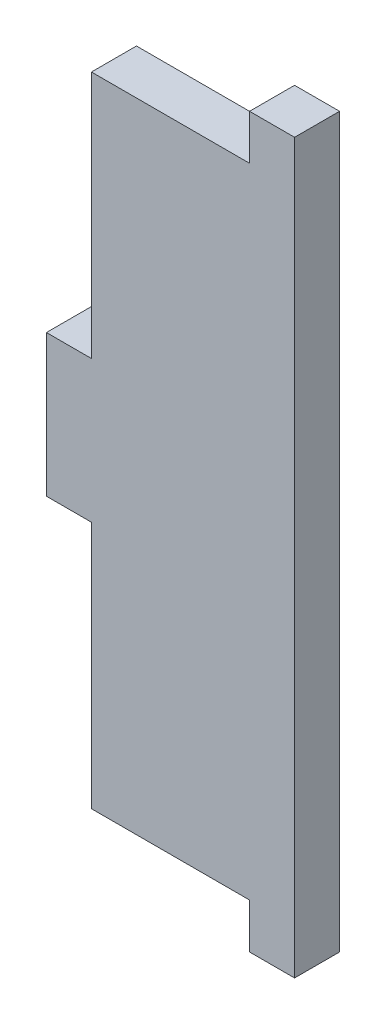
ISO-10303-21;
HEADER;
FILE_DESCRIPTION(('STEP AP214'),'2;1');
FILE_NAME('part.step','',(''),(''),'','','');
FILE_SCHEMA(('AUTOMOTIVE_DESIGN { 1 0 10303 214 1 1 1 1 }'));
ENDSEC;
DATA;
#1=APPLICATION_CONTEXT('core data for automotive mechanical design processes');
#2=APPLICATION_PROTOCOL_DEFINITION('international standard','automotive_design',2000,#1);
#3=PRODUCT_CONTEXT('',#1,'mechanical');
#4=PRODUCT('Part','Part','',(#3));
#5=PRODUCT_RELATED_PRODUCT_CATEGORY('part','',(#4));
#6=PRODUCT_DEFINITION_FORMATION('','',#4);
#7=PRODUCT_DEFINITION_CONTEXT('part definition',#1,'design');
#8=PRODUCT_DEFINITION('design','',#6,#7);
#9=PRODUCT_DEFINITION_SHAPE('','',#8);
#10=(LENGTH_UNIT() NAMED_UNIT(*) SI_UNIT(.MILLI.,.METRE.));
#11=(NAMED_UNIT(*) PLANE_ANGLE_UNIT() SI_UNIT($,.RADIAN.));
#12=(NAMED_UNIT(*) SI_UNIT($,.STERADIAN.) SOLID_ANGLE_UNIT());
#13=UNCERTAINTY_MEASURE_WITH_UNIT(LENGTH_MEASURE(1.E-05),#10,'distance_accuracy_value','');
#14=(GEOMETRIC_REPRESENTATION_CONTEXT(3) GLOBAL_UNCERTAINTY_ASSIGNED_CONTEXT((#13)) GLOBAL_UNIT_ASSIGNED_CONTEXT((#10,
#11,#12)) REPRESENTATION_CONTEXT('',''));
#15=CARTESIAN_POINT('',(0.,0.,0.));
#16=DIRECTION('',(0.,0.,1.));
#17=DIRECTION('',(1.,0.,0.));
#18=AXIS2_PLACEMENT_3D('',#15,#16,#17);
#19=CARTESIAN_POINT('',(0.,0.,6.35));
#20=DIRECTION('',(0.,-1.,0.));
#21=DIRECTION('',(0.,0.,-1.));
#22=AXIS2_PLACEMENT_3D('',#19,#20,#21);
#23=PLANE('',#22);
#24=DIRECTION('',(-1.,0.,0.));
#25=VECTOR('',#24,1.);
#26=CARTESIAN_POINT('',(0.,0.,0.));
#27=LINE('',#26,#25);
#28=CARTESIAN_POINT('',(22.3,0.,0.));
#29=VERTEX_POINT('',#28);
#30=CARTESIAN_POINT('',(0.,0.,0.));
#31=VERTEX_POINT('',#30);
#32=EDGE_CURVE('E152',#29,#31,#27,.T.);
#33=ORIENTED_EDGE('',*,*,#32,.T.);
#34=DIRECTION('',(0.,0.,-1.));
#35=VECTOR('',#34,1.);
#36=CARTESIAN_POINT('',(0.,0.,6.35));
#37=LINE('',#36,#35);
#38=CARTESIAN_POINT('',(0.,0.,6.35));
#39=VERTEX_POINT('',#38);
#40=EDGE_CURVE('E11',#39,#31,#37,.T.);
#41=ORIENTED_EDGE('',*,*,#40,.F.);
#42=DIRECTION('',(-1.,0.,0.));
#43=VECTOR('',#42,1.);
#44=CARTESIAN_POINT('',(0.,0.,6.35));
#45=LINE('',#44,#43);
#46=CARTESIAN_POINT('',(22.3,0.,6.35));
#47=VERTEX_POINT('',#46);
#48=EDGE_CURVE('E175',#47,#39,#45,.T.);
#49=ORIENTED_EDGE('',*,*,#48,.F.);
#50=DIRECTION('',(0.,0.,-1.));
#51=VECTOR('',#50,1.);
#52=CARTESIAN_POINT('',(22.3,0.,6.35));
#53=LINE('',#52,#51);
#54=EDGE_CURVE('E148',#47,#29,#53,.T.);
#55=ORIENTED_EDGE('',*,*,#54,.T.);
#56=EDGE_LOOP('',(#33,#41,#49,#55));
#57=FACE_BOUND('',#56,.T.);
#58=ADVANCED_FACE('F33',(#57),#23,.F.);
#59=CARTESIAN_POINT('',(0.,0.,6.35));
#60=DIRECTION('',(1.,0.,0.));
#61=DIRECTION('',(0.,1.,0.));
#62=AXIS2_PLACEMENT_3D('',#59,#60,#61);
#63=PLANE('',#62);
#64=DIRECTION('',(0.,-1.,0.));
#65=VECTOR('',#64,1.);
#66=CARTESIAN_POINT('',(0.,0.,0.));
#67=LINE('',#66,#65);
#68=CARTESIAN_POINT('',(0.,-35.,0.));
#69=VERTEX_POINT('',#68);
#70=EDGE_CURVE('E155',#31,#69,#67,.T.);
#71=ORIENTED_EDGE('',*,*,#70,.T.);
#72=DIRECTION('',(0.,0.,-1.));
#73=VECTOR('',#72,1.);
#74=CARTESIAN_POINT('',(0.,-35.,6.35));
#75=LINE('',#74,#73);
#76=CARTESIAN_POINT('',(0.,-35.,6.35));
#77=VERTEX_POINT('',#76);
#78=EDGE_CURVE('E41',#77,#69,#75,.T.);
#79=ORIENTED_EDGE('',*,*,#78,.F.);
#80=DIRECTION('',(0.,-1.,0.));
#81=VECTOR('',#80,1.);
#82=CARTESIAN_POINT('',(0.,0.,6.35));
#83=LINE('',#82,#81);
#84=EDGE_CURVE('E104',#39,#77,#83,.T.);
#85=ORIENTED_EDGE('',*,*,#84,.F.);
#86=ORIENTED_EDGE('',*,*,#40,.T.);
#87=EDGE_LOOP('',(#71,#79,#85,#86));
#88=FACE_BOUND('',#87,.T.);
#89=ADVANCED_FACE('F254',(#88),#63,.F.);
#90=CARTESIAN_POINT('',(0.,-35.,6.35));
#91=DIRECTION('',(0.,-1.,0.));
#92=DIRECTION('',(0.,0.,-1.));
#93=AXIS2_PLACEMENT_3D('',#90,#91,#92);
#94=PLANE('',#93);
#95=DIRECTION('',(-1.,0.,0.));
#96=VECTOR('',#95,1.);
#97=CARTESIAN_POINT('',(0.,-35.,0.));
#98=LINE('',#97,#96);
#99=CARTESIAN_POINT('',(-6.35,-35.,0.));
#100=VERTEX_POINT('',#99);
#101=EDGE_CURVE('E157',#69,#100,#98,.T.);
#102=ORIENTED_EDGE('',*,*,#101,.T.);
#103=DIRECTION('',(0.,0.,-1.));
#104=VECTOR('',#103,1.);
#105=CARTESIAN_POINT('',(-6.35,-35.,6.35));
#106=LINE('',#105,#104);
#107=CARTESIAN_POINT('',(-6.35,-35.,6.35));
#108=VERTEX_POINT('',#107);
#109=EDGE_CURVE('E194',#108,#100,#106,.T.);
#110=ORIENTED_EDGE('',*,*,#109,.F.);
#111=DIRECTION('',(-1.,0.,0.));
#112=VECTOR('',#111,1.);
#113=CARTESIAN_POINT('',(0.,-35.,6.35));
#114=LINE('',#113,#112);
#115=EDGE_CURVE('E202',#77,#108,#114,.T.);
#116=ORIENTED_EDGE('',*,*,#115,.F.);
#117=ORIENTED_EDGE('',*,*,#78,.T.);
#118=EDGE_LOOP('',(#102,#110,#116,#117));
#119=FACE_BOUND('',#118,.T.);
#120=ADVANCED_FACE('F200',(#119),#94,.F.);
#121=CARTESIAN_POINT('',(-6.35,-35.,6.35));
#122=DIRECTION('',(1.,0.,0.));
#123=DIRECTION('',(0.,1.,0.));
#124=AXIS2_PLACEMENT_3D('',#121,#122,#123);
#125=PLANE('',#124);
#126=DIRECTION('',(0.,-1.,0.));
#127=VECTOR('',#126,1.);
#128=CARTESIAN_POINT('',(-6.35,-35.,0.));
#129=LINE('',#128,#127);
#130=CARTESIAN_POINT('',(-6.34999999999999,-55.,0.));
#131=VERTEX_POINT('',#130);
#132=EDGE_CURVE('E159',#100,#131,#129,.T.);
#133=ORIENTED_EDGE('',*,*,#132,.T.);
#134=DIRECTION('',(0.,0.,-1.));
#135=VECTOR('',#134,1.);
#136=CARTESIAN_POINT('',(-6.34999999999999,-55.,6.35));
#137=LINE('',#136,#135);
#138=CARTESIAN_POINT('',(-6.34999999999999,-55.,6.35));
#139=VERTEX_POINT('',#138);
#140=EDGE_CURVE('E191',#139,#131,#137,.T.);
#141=ORIENTED_EDGE('',*,*,#140,.F.);
#142=DIRECTION('',(0.,-1.,0.));
#143=VECTOR('',#142,1.);
#144=CARTESIAN_POINT('',(-6.35,-35.,6.35));
#145=LINE('',#144,#143);
#146=EDGE_CURVE('E220',#108,#139,#145,.T.);
#147=ORIENTED_EDGE('',*,*,#146,.F.);
#148=ORIENTED_EDGE('',*,*,#109,.T.);
#149=EDGE_LOOP('',(#133,#141,#147,#148));
#150=FACE_BOUND('',#149,.T.);
#151=ADVANCED_FACE('F211',(#150),#125,.F.);
#152=CARTESIAN_POINT('',(-6.34999999999999,-55.,6.35));
#153=DIRECTION('',(0.,1.,0.));
#154=DIRECTION('',(0.,0.,1.));
#155=AXIS2_PLACEMENT_3D('',#152,#153,#154);
#156=PLANE('',#155);
#157=DIRECTION('',(1.,0.,0.));
#158=VECTOR('',#157,1.);
#159=CARTESIAN_POINT('',(-6.34999999999999,-55.,0.));
#160=LINE('',#159,#158);
#161=CARTESIAN_POINT('',(0.,-55.,0.));
#162=VERTEX_POINT('',#161);
#163=EDGE_CURVE('E161',#131,#162,#160,.T.);
#164=ORIENTED_EDGE('',*,*,#163,.T.);
#165=DIRECTION('',(0.,0.,-1.));
#166=VECTOR('',#165,1.);
#167=CARTESIAN_POINT('',(0.,-55.,6.35));
#168=LINE('',#167,#166);
#169=CARTESIAN_POINT('',(0.,-55.,6.35));
#170=VERTEX_POINT('',#169);
#171=EDGE_CURVE('E188',#170,#162,#168,.T.);
#172=ORIENTED_EDGE('',*,*,#171,.F.);
#173=DIRECTION('',(1.,0.,0.));
#174=VECTOR('',#173,1.);
#175=CARTESIAN_POINT('',(-6.34999999999999,-55.,6.35));
#176=LINE('',#175,#174);
#177=EDGE_CURVE('E217',#139,#170,#176,.T.);
#178=ORIENTED_EDGE('',*,*,#177,.F.);
#179=ORIENTED_EDGE('',*,*,#140,.T.);
#180=EDGE_LOOP('',(#164,#172,#178,#179));
#181=FACE_BOUND('',#180,.T.);
#182=ADVANCED_FACE('F215',(#181),#156,.F.);
#183=CARTESIAN_POINT('',(0.,-55.,6.35));
#184=DIRECTION('',(1.,0.,0.));
#185=DIRECTION('',(0.,1.,0.));
#186=AXIS2_PLACEMENT_3D('',#183,#184,#185);
#187=PLANE('',#186);
#188=DIRECTION('',(0.,-1.,0.));
#189=VECTOR('',#188,1.);
#190=CARTESIAN_POINT('',(0.,-55.,0.));
#191=LINE('',#190,#189);
#192=CARTESIAN_POINT('',(0.,-90.,0.));
#193=VERTEX_POINT('',#192);
#194=EDGE_CURVE('E163',#162,#193,#191,.T.);
#195=ORIENTED_EDGE('',*,*,#194,.T.);
#196=DIRECTION('',(0.,0.,-1.));
#197=VECTOR('',#196,1.);
#198=CARTESIAN_POINT('',(0.,-90.,6.35));
#199=LINE('',#198,#197);
#200=CARTESIAN_POINT('',(0.,-90.,6.35));
#201=VERTEX_POINT('',#200);
#202=EDGE_CURVE('E185',#201,#193,#199,.T.);
#203=ORIENTED_EDGE('',*,*,#202,.F.);
#204=DIRECTION('',(0.,-1.,0.));
#205=VECTOR('',#204,1.);
#206=CARTESIAN_POINT('',(0.,-55.,6.35));
#207=LINE('',#206,#205);
#208=EDGE_CURVE('E219',#170,#201,#207,.T.);
#209=ORIENTED_EDGE('',*,*,#208,.F.);
#210=ORIENTED_EDGE('',*,*,#171,.T.);
#211=EDGE_LOOP('',(#195,#203,#209,#210));
#212=FACE_BOUND('',#211,.T.);
#213=ADVANCED_FACE('F267',(#212),#187,.F.);
#214=CARTESIAN_POINT('',(0.,-90.,6.35));
#215=DIRECTION('',(0.,1.,0.));
#216=DIRECTION('',(0.,0.,1.));
#217=AXIS2_PLACEMENT_3D('',#214,#215,#216);
#218=PLANE('',#217);
#219=DIRECTION('',(1.,0.,0.));
#220=VECTOR('',#219,1.);
#221=CARTESIAN_POINT('',(0.,-90.,0.));
#222=LINE('',#221,#220);
#223=CARTESIAN_POINT('',(22.3,-90.,0.));
#224=VERTEX_POINT('',#223);
#225=EDGE_CURVE('E165',#193,#224,#222,.T.);
#226=ORIENTED_EDGE('',*,*,#225,.T.);
#227=DIRECTION('',(0.,0.,-1.));
#228=VECTOR('',#227,1.);
#229=CARTESIAN_POINT('',(22.3,-90.,6.35));
#230=LINE('',#229,#228);
#231=CARTESIAN_POINT('',(22.3,-90.,6.35));
#232=VERTEX_POINT('',#231);
#233=EDGE_CURVE('E182',#232,#224,#230,.T.);
#234=ORIENTED_EDGE('',*,*,#233,.F.);
#235=DIRECTION('',(1.,0.,0.));
#236=VECTOR('',#235,1.);
#237=CARTESIAN_POINT('',(0.,-90.,6.35));
#238=LINE('',#237,#236);
#239=EDGE_CURVE('E222',#201,#232,#238,.T.);
#240=ORIENTED_EDGE('',*,*,#239,.F.);
#241=ORIENTED_EDGE('',*,*,#202,.T.);
#242=EDGE_LOOP('',(#226,#234,#240,#241));
#243=FACE_BOUND('',#242,.T.);
#244=ADVANCED_FACE('F270',(#243),#218,.F.);
#245=CARTESIAN_POINT('',(22.3,-96.35,6.35));
#246=DIRECTION('',(1.,0.,0.));
#247=DIRECTION('',(0.,1.,0.));
#248=AXIS2_PLACEMENT_3D('',#245,#246,#247);
#249=PLANE('',#248);
#250=DIRECTION('',(0.,-1.,0.));
#251=VECTOR('',#250,1.);
#252=CARTESIAN_POINT('',(22.3,-96.35,0.));
#253=LINE('',#252,#251);
#254=CARTESIAN_POINT('',(22.3,-96.35,0.));
#255=VERTEX_POINT('',#254);
#256=EDGE_CURVE('E167',#224,#255,#253,.T.);
#257=ORIENTED_EDGE('',*,*,#256,.T.);
#258=DIRECTION('',(0.,0.,-1.));
#259=VECTOR('',#258,1.);
#260=CARTESIAN_POINT('',(22.3,-96.35,6.35));
#261=LINE('',#260,#259);
#262=CARTESIAN_POINT('',(22.3,-96.35,6.35));
#263=VERTEX_POINT('',#262);
#264=EDGE_CURVE('E179',#263,#255,#261,.T.);
#265=ORIENTED_EDGE('',*,*,#264,.F.);
#266=DIRECTION('',(0.,-1.,0.));
#267=VECTOR('',#266,1.);
#268=CARTESIAN_POINT('',(22.3,-96.35,6.35));
#269=LINE('',#268,#267);
#270=EDGE_CURVE('E228',#232,#263,#269,.T.);
#271=ORIENTED_EDGE('',*,*,#270,.F.);
#272=ORIENTED_EDGE('',*,*,#233,.T.);
#273=EDGE_LOOP('',(#257,#265,#271,#272));
#274=FACE_BOUND('',#273,.T.);
#275=ADVANCED_FACE('F234',(#274),#249,.F.);
#276=CARTESIAN_POINT('',(28.65,-96.35,6.35));
#277=DIRECTION('',(0.,1.,0.));
#278=DIRECTION('',(-1.,0.,0.));
#279=AXIS2_PLACEMENT_3D('',#276,#277,#278);
#280=PLANE('',#279);
#281=DIRECTION('',(1.,0.,0.));
#282=VECTOR('',#281,1.);
#283=CARTESIAN_POINT('',(28.65,-96.35,0.));
#284=LINE('',#283,#282);
#285=CARTESIAN_POINT('',(28.65,-96.35,0.));
#286=VERTEX_POINT('',#285);
#287=EDGE_CURVE('E169',#255,#286,#284,.T.);
#288=ORIENTED_EDGE('',*,*,#287,.T.);
#289=DIRECTION('',(0.,0.,-1.));
#290=VECTOR('',#289,1.);
#291=CARTESIAN_POINT('',(28.65,-96.35,6.35));
#292=LINE('',#291,#290);
#293=CARTESIAN_POINT('',(28.65,-96.35,6.35));
#294=VERTEX_POINT('',#293);
#295=EDGE_CURVE('E143',#294,#286,#292,.T.);
#296=ORIENTED_EDGE('',*,*,#295,.F.);
#297=DIRECTION('',(1.,0.,0.));
#298=VECTOR('',#297,1.);
#299=CARTESIAN_POINT('',(28.65,-96.35,6.35));
#300=LINE('',#299,#298);
#301=EDGE_CURVE('E135',#263,#294,#300,.T.);
#302=ORIENTED_EDGE('',*,*,#301,.F.);
#303=ORIENTED_EDGE('',*,*,#264,.T.);
#304=EDGE_LOOP('',(#288,#296,#302,#303));
#305=FACE_BOUND('',#304,.T.);
#306=ADVANCED_FACE('F238',(#305),#280,.F.);
#307=CARTESIAN_POINT('',(28.65,-6.35000000000001,6.35));
#308=DIRECTION('',(-1.,0.,0.));
#309=DIRECTION('',(0.,-1.,0.));
#310=AXIS2_PLACEMENT_3D('',#307,#308,#309);
#311=PLANE('',#310);
#312=DIRECTION('',(0.,1.,0.));
#313=VECTOR('',#312,1.);
#314=CARTESIAN_POINT('',(28.65,-6.35000000000001,0.));
#315=LINE('',#314,#313);
#316=CARTESIAN_POINT('',(28.65,6.35,0.));
#317=VERTEX_POINT('',#316);
#318=EDGE_CURVE('E142',#286,#317,#315,.T.);
#319=ORIENTED_EDGE('',*,*,#318,.T.);
#320=DIRECTION('',(0.,0.,-1.));
#321=VECTOR('',#320,1.);
#322=CARTESIAN_POINT('',(28.65,6.35,6.35));
#323=LINE('',#322,#321);
#324=CARTESIAN_POINT('',(28.65,6.35,6.35));
#325=VERTEX_POINT('',#324);
#326=EDGE_CURVE('E140',#325,#317,#323,.T.);
#327=ORIENTED_EDGE('',*,*,#326,.F.);
#328=DIRECTION('',(0.,1.,0.));
#329=VECTOR('',#328,1.);
#330=CARTESIAN_POINT('',(28.65,-90.,6.35));
#331=LINE('',#330,#329);
#332=EDGE_CURVE('E129',#294,#325,#331,.T.);
#333=ORIENTED_EDGE('',*,*,#332,.F.);
#334=ORIENTED_EDGE('',*,*,#295,.T.);
#335=EDGE_LOOP('',(#319,#327,#333,#334));
#336=FACE_BOUND('',#335,.T.);
#337=ADVANCED_FACE('F141',(#336),#311,.F.);
#338=CARTESIAN_POINT('',(28.65,6.35,6.35));
#339=DIRECTION('',(0.,-1.,0.));
#340=DIRECTION('',(0.,0.,-1.));
#341=AXIS2_PLACEMENT_3D('',#338,#339,#340);
#342=PLANE('',#341);
#343=DIRECTION('',(-1.,0.,0.));
#344=VECTOR('',#343,1.);
#345=CARTESIAN_POINT('',(28.65,6.35,0.));
#346=LINE('',#345,#344);
#347=CARTESIAN_POINT('',(22.3,6.35,0.));
#348=VERTEX_POINT('',#347);
#349=EDGE_CURVE('E90',#317,#348,#346,.T.);
#350=ORIENTED_EDGE('',*,*,#349,.T.);
#351=DIRECTION('',(0.,0.,-1.));
#352=VECTOR('',#351,1.);
#353=CARTESIAN_POINT('',(22.3,6.35,6.35));
#354=LINE('',#353,#352);
#355=CARTESIAN_POINT('',(22.3,6.35,6.35));
#356=VERTEX_POINT('',#355);
#357=EDGE_CURVE('E144',#356,#348,#354,.T.);
#358=ORIENTED_EDGE('',*,*,#357,.F.);
#359=DIRECTION('',(-1.,0.,0.));
#360=VECTOR('',#359,1.);
#361=CARTESIAN_POINT('',(28.65,6.35,6.35));
#362=LINE('',#361,#360);
#363=EDGE_CURVE('E133',#325,#356,#362,.T.);
#364=ORIENTED_EDGE('',*,*,#363,.F.);
#365=ORIENTED_EDGE('',*,*,#326,.T.);
#366=EDGE_LOOP('',(#350,#358,#364,#365));
#367=FACE_BOUND('',#366,.T.);
#368=ADVANCED_FACE('F146',(#367),#342,.F.);
#369=CARTESIAN_POINT('',(22.3,0.,6.35));
#370=DIRECTION('',(1.,0.,0.));
#371=DIRECTION('',(0.,0.,-1.));
#372=AXIS2_PLACEMENT_3D('',#369,#370,#371);
#373=PLANE('',#372);
#374=DIRECTION('',(0.,-1.,0.));
#375=VECTOR('',#374,1.);
#376=CARTESIAN_POINT('',(22.3,0.,0.));
#377=LINE('',#376,#375);
#378=EDGE_CURVE('E96',#348,#29,#377,.T.);
#379=ORIENTED_EDGE('',*,*,#378,.T.);
#380=ORIENTED_EDGE('',*,*,#54,.F.);
#381=DIRECTION('',(0.,-1.,0.));
#382=VECTOR('',#381,1.);
#383=CARTESIAN_POINT('',(22.3,0.,6.35));
#384=LINE('',#383,#382);
#385=EDGE_CURVE('E49',#356,#47,#384,.T.);
#386=ORIENTED_EDGE('',*,*,#385,.F.);
#387=ORIENTED_EDGE('',*,*,#357,.T.);
#388=EDGE_LOOP('',(#379,#380,#386,#387));
#389=FACE_BOUND('',#388,.T.);
#390=ADVANCED_FACE('F243',(#389),#373,.F.);
#391=CARTESIAN_POINT('',(0.,0.,6.35));
#392=DIRECTION('',(0.,0.,1.));
#393=DIRECTION('',(1.,0.,0.));
#394=AXIS2_PLACEMENT_3D('',#391,#392,#393);
#395=PLANE('',#394);
#396=ORIENTED_EDGE('',*,*,#48,.T.);
#397=ORIENTED_EDGE('',*,*,#84,.T.);
#398=ORIENTED_EDGE('',*,*,#115,.T.);
#399=ORIENTED_EDGE('',*,*,#146,.T.);
#400=ORIENTED_EDGE('',*,*,#177,.T.);
#401=ORIENTED_EDGE('',*,*,#208,.T.);
#402=ORIENTED_EDGE('',*,*,#239,.T.);
#403=ORIENTED_EDGE('',*,*,#270,.T.);
#404=ORIENTED_EDGE('',*,*,#301,.T.);
#405=ORIENTED_EDGE('',*,*,#332,.T.);
#406=ORIENTED_EDGE('',*,*,#363,.T.);
#407=ORIENTED_EDGE('',*,*,#385,.T.);
#408=EDGE_LOOP('',(#396,#397,#398,#399,#400,#401,#402,#403,#404,#405,#406,#407));
#409=FACE_BOUND('',#408,.T.);
#410=ADVANCED_FACE('F131',(#409),#395,.T.);
#411=CARTESIAN_POINT('',(0.,0.,0.));
#412=DIRECTION('',(0.,0.,1.));
#413=DIRECTION('',(1.,0.,0.));
#414=AXIS2_PLACEMENT_3D('',#411,#412,#413);
#415=PLANE('',#414);
#416=ORIENTED_EDGE('',*,*,#32,.F.);
#417=ORIENTED_EDGE('',*,*,#378,.F.);
#418=ORIENTED_EDGE('',*,*,#349,.F.);
#419=ORIENTED_EDGE('',*,*,#318,.F.);
#420=ORIENTED_EDGE('',*,*,#287,.F.);
#421=ORIENTED_EDGE('',*,*,#256,.F.);
#422=ORIENTED_EDGE('',*,*,#225,.F.);
#423=ORIENTED_EDGE('',*,*,#194,.F.);
#424=ORIENTED_EDGE('',*,*,#163,.F.);
#425=ORIENTED_EDGE('',*,*,#132,.F.);
#426=ORIENTED_EDGE('',*,*,#101,.F.);
#427=ORIENTED_EDGE('',*,*,#70,.F.);
#428=EDGE_LOOP('',(#416,#417,#418,#419,#420,#421,#422,#423,#424,#425,#426,#427));
#429=FACE_BOUND('',#428,.T.);
#430=ADVANCED_FACE('F206',(#429),#415,.F.);
#431=CLOSED_SHELL('',(#58,#89,#120,#151,#182,#213,#244,#275,#306,#337,#368,#390,#410,#430));
#432=MANIFOLD_SOLID_BREP('B2',#431);
#433=ADVANCED_BREP_SHAPE_REPRESENTATION('',(#18,#432),#14);
#434=SHAPE_DEFINITION_REPRESENTATION(#9,#433);
ENDSEC;
END-ISO-10303-21;
